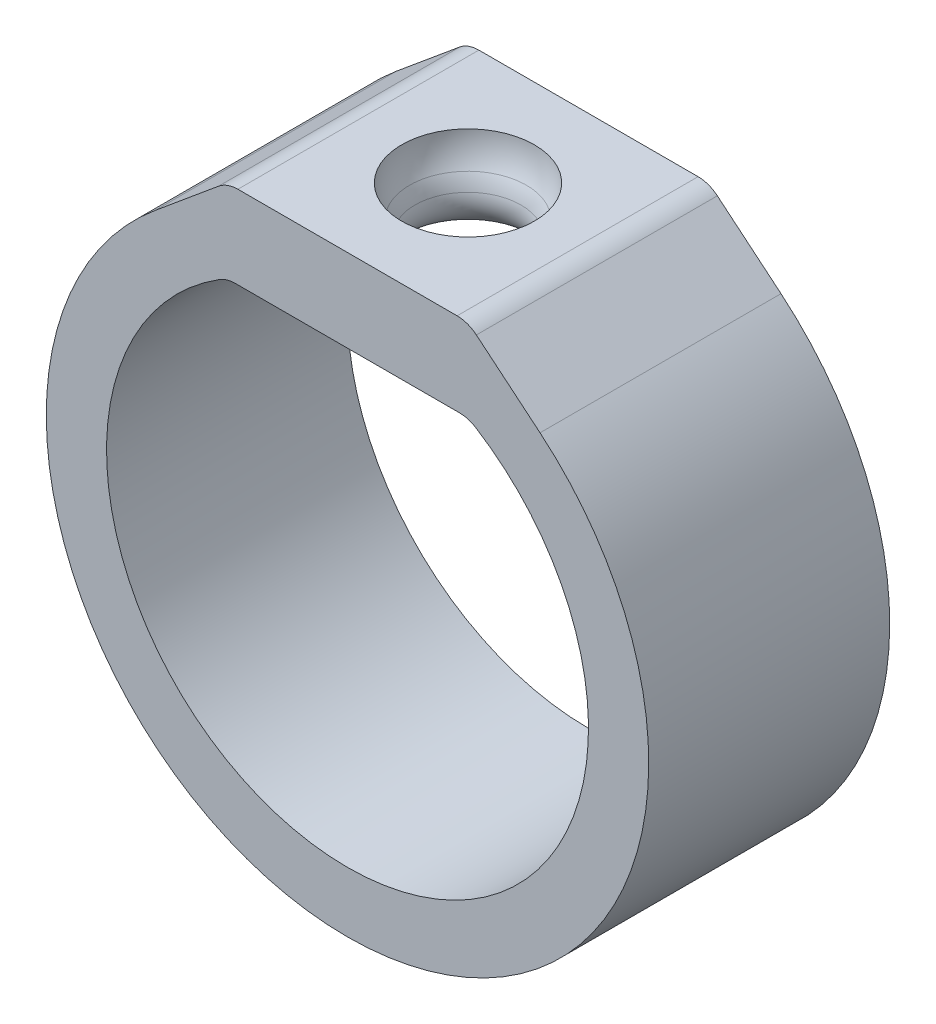
ISO-10303-21;
HEADER;
FILE_DESCRIPTION(('STEP AP214'),'2;1');
FILE_NAME('part.step','',(''),(''),'','','');
FILE_SCHEMA(('AUTOMOTIVE_DESIGN { 1 0 10303 214 1 1 1 1 }'));
ENDSEC;
DATA;
#1=APPLICATION_CONTEXT('core data for automotive mechanical design processes');
#2=APPLICATION_PROTOCOL_DEFINITION('international standard','automotive_design',2000,#1);
#3=PRODUCT_CONTEXT('',#1,'mechanical');
#4=PRODUCT('Part','Part','',(#3));
#5=PRODUCT_RELATED_PRODUCT_CATEGORY('part','',(#4));
#6=PRODUCT_DEFINITION_FORMATION('','',#4);
#7=PRODUCT_DEFINITION_CONTEXT('part definition',#1,'design');
#8=PRODUCT_DEFINITION('design','',#6,#7);
#9=PRODUCT_DEFINITION_SHAPE('','',#8);
#10=(LENGTH_UNIT() NAMED_UNIT(*) SI_UNIT(.MILLI.,.METRE.));
#11=(NAMED_UNIT(*) PLANE_ANGLE_UNIT() SI_UNIT($,.RADIAN.));
#12=(NAMED_UNIT(*) SI_UNIT($,.STERADIAN.) SOLID_ANGLE_UNIT());
#13=UNCERTAINTY_MEASURE_WITH_UNIT(LENGTH_MEASURE(1.E-05),#10,'distance_accuracy_value','');
#14=(GEOMETRIC_REPRESENTATION_CONTEXT(3) GLOBAL_UNCERTAINTY_ASSIGNED_CONTEXT((#13)) GLOBAL_UNIT_ASSIGNED_CONTEXT((#10,
#11,#12)) REPRESENTATION_CONTEXT('',''));
#15=CARTESIAN_POINT('',(0.,0.,0.));
#16=DIRECTION('',(0.,0.,1.));
#17=DIRECTION('',(1.,0.,0.));
#18=AXIS2_PLACEMENT_3D('',#15,#16,#17);
#19=CARTESIAN_POINT('',(0.,0.,4.));
#20=DIRECTION('',(0.,0.,-1.));
#21=DIRECTION('',(-1.,0.,0.));
#22=AXIS2_PLACEMENT_3D('',#19,#20,#21);
#23=PLANE('',#22);
#24=DIRECTION('',(-1.,0.,0.));
#25=VECTOR('',#24,1.);
#26=CARTESIAN_POINT('',(-4.,9.67820323027551,4.));
#27=LINE('',#26,#25);
#28=CARTESIAN_POINT('',(3.63872314880659,9.67820323027551,4.));
#29=VERTEX_POINT('',#28);
#30=CARTESIAN_POINT('',(-3.63872314880659,9.67820323027551,4.));
#31=VERTEX_POINT('',#30);
#32=EDGE_CURVE('E121',#29,#31,#27,.T.);
#33=ORIENTED_EDGE('',*,*,#32,.T.);
#34=CARTESIAN_POINT('',(-3.63872314880659,8.67820323027551,4.));
#35=DIRECTION('',(0.,0.,-1.));
#36=DIRECTION('',(-1.,0.,0.));
#37=AXIS2_PLACEMENT_3D('',#34,#35,#36);
#38=CIRCLE('',#37,1.);
#39=CARTESIAN_POINT('',(-4.27785654473791,9.44729912950089,4.));
#40=VERTEX_POINT('',#39);
#41=EDGE_CURVE('E166',#31,#40,#38,.F.);
#42=ORIENTED_EDGE('',*,*,#41,.T.);
#43=DIRECTION('',(-0.769095899225379,-0.639133395931324,0.));
#44=VECTOR('',#43,1.);
#45=CARTESIAN_POINT('',(-6.39133395931324,7.69095899225379,4.));
#46=LINE('',#45,#44);
#47=CARTESIAN_POINT('',(-6.39133395931324,7.69095899225379,4.));
#48=VERTEX_POINT('',#47);
#49=EDGE_CURVE('E127',#40,#48,#46,.T.);
#50=ORIENTED_EDGE('',*,*,#49,.T.);
#51=CARTESIAN_POINT('',(0.,0.,4.));
#52=DIRECTION('',(0.,0.,1.));
#53=DIRECTION('',(-1.,0.,0.));
#54=AXIS2_PLACEMENT_3D('',#51,#52,#53);
#55=CIRCLE('',#54,10.);
#56=CARTESIAN_POINT('',(6.39133395931324,7.69095899225379,4.));
#57=VERTEX_POINT('',#56);
#58=EDGE_CURVE('E122',#48,#57,#55,.T.);
#59=ORIENTED_EDGE('',*,*,#58,.T.);
#60=DIRECTION('',(-0.769095899225379,0.639133395931324,0.));
#61=VECTOR('',#60,1.);
#62=CARTESIAN_POINT('',(6.39133395931324,7.69095899225379,4.));
#63=LINE('',#62,#61);
#64=CARTESIAN_POINT('',(4.27785654473791,9.44729912950089,4.));
#65=VERTEX_POINT('',#64);
#66=EDGE_CURVE('E110',#57,#65,#63,.T.);
#67=ORIENTED_EDGE('',*,*,#66,.T.);
#68=CARTESIAN_POINT('',(3.63872314880659,8.67820323027551,4.));
#69=DIRECTION('',(0.,0.,-1.));
#70=DIRECTION('',(-1.,0.,0.));
#71=AXIS2_PLACEMENT_3D('',#68,#69,#70);
#72=CIRCLE('',#71,1.);
#73=EDGE_CURVE('E164',#65,#29,#72,.F.);
#74=ORIENTED_EDGE('',*,*,#73,.T.);
#75=EDGE_LOOP('',(#33,#42,#50,#59,#67,#74));
#76=FACE_BOUND('',#75,.T.);
#77=CARTESIAN_POINT('',(0.,0.,4.));
#78=DIRECTION('',(0.,0.,1.));
#79=DIRECTION('',(1.,0.,0.));
#80=AXIS2_PLACEMENT_3D('',#77,#78,#79);
#81=CIRCLE('',#80,8.);
#82=CARTESIAN_POINT('',(-4.2541936416096,6.77508940602915,4.));
#83=VERTEX_POINT('',#82);
#84=CARTESIAN_POINT('',(4.2541936416096,6.77508940602915,4.));
#85=VERTEX_POINT('',#84);
#86=EDGE_CURVE('E198',#83,#85,#81,.T.);
#87=ORIENTED_EDGE('',*,*,#86,.F.);
#88=CARTESIAN_POINT('',(-3.7224194364084,5.92820323027551,4.));
#89=DIRECTION('',(0.,0.,-1.));
#90=DIRECTION('',(-1.,0.,0.));
#91=AXIS2_PLACEMENT_3D('',#88,#89,#90);
#92=CIRCLE('',#91,1.);
#93=CARTESIAN_POINT('',(-3.7224194364084,6.92820323027551,4.));
#94=VERTEX_POINT('',#93);
#95=EDGE_CURVE('E11',#83,#94,#92,.T.);
#96=ORIENTED_EDGE('',*,*,#95,.T.);
#97=DIRECTION('',(-1.,0.,0.));
#98=VECTOR('',#97,1.);
#99=CARTESIAN_POINT('',(-4.,6.92820323027551,4.));
#100=LINE('',#99,#98);
#101=CARTESIAN_POINT('',(3.7224194364084,6.92820323027551,4.));
#102=VERTEX_POINT('',#101);
#103=EDGE_CURVE('E196',#102,#94,#100,.T.);
#104=ORIENTED_EDGE('',*,*,#103,.F.);
#105=CARTESIAN_POINT('',(3.7224194364084,5.92820323027551,4.));
#106=DIRECTION('',(0.,0.,-1.));
#107=DIRECTION('',(-1.,0.,0.));
#108=AXIS2_PLACEMENT_3D('',#105,#106,#107);
#109=CIRCLE('',#108,1.);
#110=EDGE_CURVE('E180',#102,#85,#109,.T.);
#111=ORIENTED_EDGE('',*,*,#110,.T.);
#112=EDGE_LOOP('',(#87,#96,#104,#111));
#113=FACE_BOUND('',#112,.T.);
#114=ADVANCED_FACE('F33',(#76,#113),#23,.F.);
#115=CARTESIAN_POINT('',(0.,0.,-4.));
#116=DIRECTION('',(0.,0.,-1.));
#117=DIRECTION('',(-1.,0.,0.));
#118=AXIS2_PLACEMENT_3D('',#115,#116,#117);
#119=PLANE('',#118);
#120=DIRECTION('',(-0.769095899225379,-0.639133395931324,0.));
#121=VECTOR('',#120,1.);
#122=CARTESIAN_POINT('',(-6.39133395931324,7.69095899225379,-4.));
#123=LINE('',#122,#121);
#124=CARTESIAN_POINT('',(-4.27785654473791,9.44729912950089,-4.));
#125=VERTEX_POINT('',#124);
#126=CARTESIAN_POINT('',(-6.39133395931324,7.69095899225379,-4.));
#127=VERTEX_POINT('',#126);
#128=EDGE_CURVE('E131',#125,#127,#123,.T.);
#129=ORIENTED_EDGE('',*,*,#128,.F.);
#130=CARTESIAN_POINT('',(-3.63872314880659,8.67820323027551,-4.));
#131=DIRECTION('',(0.,0.,-1.));
#132=DIRECTION('',(-1.,0.,0.));
#133=AXIS2_PLACEMENT_3D('',#130,#131,#132);
#134=CIRCLE('',#133,1.);
#135=CARTESIAN_POINT('',(-3.63872314880659,9.67820323027551,-4.));
#136=VERTEX_POINT('',#135);
#137=EDGE_CURVE('E157',#125,#136,#134,.T.);
#138=ORIENTED_EDGE('',*,*,#137,.T.);
#139=DIRECTION('',(-1.,0.,0.));
#140=VECTOR('',#139,1.);
#141=CARTESIAN_POINT('',(-4.,9.67820323027551,-4.));
#142=LINE('',#141,#140);
#143=CARTESIAN_POINT('',(3.63872314880659,9.67820323027551,-4.));
#144=VERTEX_POINT('',#143);
#145=EDGE_CURVE('E209',#144,#136,#142,.T.);
#146=ORIENTED_EDGE('',*,*,#145,.F.);
#147=CARTESIAN_POINT('',(3.63872314880659,8.67820323027551,-4.));
#148=DIRECTION('',(0.,0.,-1.));
#149=DIRECTION('',(-1.,0.,0.));
#150=AXIS2_PLACEMENT_3D('',#147,#148,#149);
#151=CIRCLE('',#150,1.);
#152=CARTESIAN_POINT('',(4.27785654473791,9.44729912950089,-4.));
#153=VERTEX_POINT('',#152);
#154=EDGE_CURVE('E155',#144,#153,#151,.T.);
#155=ORIENTED_EDGE('',*,*,#154,.T.);
#156=DIRECTION('',(-0.769095899225379,0.639133395931324,0.));
#157=VECTOR('',#156,1.);
#158=CARTESIAN_POINT('',(6.39133395931324,7.69095899225379,-4.));
#159=LINE('',#158,#157);
#160=CARTESIAN_POINT('',(6.39133395931324,7.69095899225379,-4.));
#161=VERTEX_POINT('',#160);
#162=EDGE_CURVE('E200',#161,#153,#159,.T.);
#163=ORIENTED_EDGE('',*,*,#162,.F.);
#164=CARTESIAN_POINT('',(0.,0.,-4.));
#165=DIRECTION('',(0.,0.,1.));
#166=DIRECTION('',(-1.,0.,0.));
#167=AXIS2_PLACEMENT_3D('',#164,#165,#166);
#168=CIRCLE('',#167,10.);
#169=EDGE_CURVE('E135',#127,#161,#168,.T.);
#170=ORIENTED_EDGE('',*,*,#169,.F.);
#171=EDGE_LOOP('',(#129,#138,#146,#155,#163,#170));
#172=FACE_BOUND('',#171,.T.);
#173=CARTESIAN_POINT('',(0.,0.,-4.));
#174=DIRECTION('',(0.,0.,1.));
#175=DIRECTION('',(1.,0.,0.));
#176=AXIS2_PLACEMENT_3D('',#173,#174,#175);
#177=CIRCLE('',#176,8.);
#178=CARTESIAN_POINT('',(-4.2541936416096,6.77508940602915,-4.));
#179=VERTEX_POINT('',#178);
#180=CARTESIAN_POINT('',(4.2541936416096,6.77508940602915,-4.));
#181=VERTEX_POINT('',#180);
#182=EDGE_CURVE('E147',#179,#181,#177,.T.);
#183=ORIENTED_EDGE('',*,*,#182,.T.);
#184=CARTESIAN_POINT('',(3.7224194364084,5.92820323027551,-4.));
#185=DIRECTION('',(0.,0.,-1.));
#186=DIRECTION('',(-1.,0.,0.));
#187=AXIS2_PLACEMENT_3D('',#184,#185,#186);
#188=CIRCLE('',#187,1.);
#189=CARTESIAN_POINT('',(3.7224194364084,6.92820323027551,-4.));
#190=VERTEX_POINT('',#189);
#191=EDGE_CURVE('E178',#181,#190,#188,.F.);
#192=ORIENTED_EDGE('',*,*,#191,.T.);
#193=DIRECTION('',(-1.,0.,0.));
#194=VECTOR('',#193,1.);
#195=CARTESIAN_POINT('',(-4.,6.92820323027551,-4.));
#196=LINE('',#195,#194);
#197=CARTESIAN_POINT('',(-3.7224194364084,6.92820323027551,-4.));
#198=VERTEX_POINT('',#197);
#199=EDGE_CURVE('E186',#190,#198,#196,.T.);
#200=ORIENTED_EDGE('',*,*,#199,.T.);
#201=CARTESIAN_POINT('',(-3.7224194364084,5.92820323027551,-4.));
#202=DIRECTION('',(0.,0.,-1.));
#203=DIRECTION('',(-1.,0.,0.));
#204=AXIS2_PLACEMENT_3D('',#201,#202,#203);
#205=CIRCLE('',#204,1.);
#206=EDGE_CURVE('E41',#198,#179,#205,.F.);
#207=ORIENTED_EDGE('',*,*,#206,.T.);
#208=EDGE_LOOP('',(#183,#192,#200,#207));
#209=FACE_BOUND('',#208,.T.);
#210=ADVANCED_FACE('F185',(#172,#209),#119,.T.);
#211=CARTESIAN_POINT('',(0.,0.,4.));
#212=DIRECTION('',(0.,0.,-1.));
#213=DIRECTION('',(-1.,0.,0.));
#214=AXIS2_PLACEMENT_3D('',#211,#212,#213);
#215=CYLINDRICAL_SURFACE('',#214,10.);
#216=ORIENTED_EDGE('',*,*,#169,.T.);
#217=DIRECTION('',(0.,0.,-1.));
#218=VECTOR('',#217,1.);
#219=CARTESIAN_POINT('',(6.39133395931324,7.69095899225379,4.));
#220=LINE('',#219,#218);
#221=EDGE_CURVE('E115',#57,#161,#220,.T.);
#222=ORIENTED_EDGE('',*,*,#221,.F.);
#223=ORIENTED_EDGE('',*,*,#58,.F.);
#224=DIRECTION('',(0.,0.,-1.));
#225=VECTOR('',#224,1.);
#226=CARTESIAN_POINT('',(-6.39133395931324,7.69095899225379,4.));
#227=LINE('',#226,#225);
#228=EDGE_CURVE('E137',#48,#127,#227,.T.);
#229=ORIENTED_EDGE('',*,*,#228,.T.);
#230=EDGE_LOOP('',(#216,#222,#223,#229));
#231=FACE_BOUND('',#230,.T.);
#232=ADVANCED_FACE('F133',(#231),#215,.T.);
#233=CARTESIAN_POINT('',(6.39133395931324,7.69095899225379,4.));
#234=DIRECTION('',(-0.639133395931324,-0.769095899225379,0.));
#235=DIRECTION('',(0.769095899225379,-0.639133395931324,0.));
#236=AXIS2_PLACEMENT_3D('',#233,#234,#235);
#237=PLANE('',#236);
#238=ORIENTED_EDGE('',*,*,#162,.T.);
#239=DIRECTION('',(0.,0.,-1.));
#240=VECTOR('',#239,1.);
#241=CARTESIAN_POINT('',(4.27785654473791,9.44729912950089,4.));
#242=LINE('',#241,#240);
#243=EDGE_CURVE('E118',#153,#65,#242,.F.);
#244=ORIENTED_EDGE('',*,*,#243,.T.);
#245=ORIENTED_EDGE('',*,*,#66,.F.);
#246=ORIENTED_EDGE('',*,*,#221,.T.);
#247=EDGE_LOOP('',(#238,#244,#245,#246));
#248=FACE_BOUND('',#247,.T.);
#249=ADVANCED_FACE('F113',(#248),#237,.F.);
#250=CARTESIAN_POINT('',(-4.,9.67820323027551,4.));
#251=DIRECTION('',(0.,-1.,0.));
#252=DIRECTION('',(0.,0.,-1.));
#253=AXIS2_PLACEMENT_3D('',#250,#251,#252);
#254=PLANE('',#253);
#255=CARTESIAN_POINT('',(0.,9.67820323027551,0.));
#256=DIRECTION('',(0.,-1.,0.));
#257=DIRECTION('',(0.,0.,-1.));
#258=AXIS2_PLACEMENT_3D('',#255,#256,#257);
#259=CIRCLE('',#258,2.20000000000001);
#260=CARTESIAN_POINT('',(0.,9.67820323027551,-2.20000000000001));
#261=VERTEX_POINT('',#260);
#262=EDGE_CURVE('E145',#261,#261,#259,.T.);
#263=ORIENTED_EDGE('',*,*,#262,.T.);
#264=EDGE_LOOP('',(#263));
#265=FACE_BOUND('',#264,.T.);
#266=ORIENTED_EDGE('',*,*,#145,.T.);
#267=DIRECTION('',(0.,0.,-1.));
#268=VECTOR('',#267,1.);
#269=CARTESIAN_POINT('',(-3.63872314880659,9.67820323027551,4.));
#270=LINE('',#269,#268);
#271=EDGE_CURVE('E162',#136,#31,#270,.F.);
#272=ORIENTED_EDGE('',*,*,#271,.T.);
#273=ORIENTED_EDGE('',*,*,#32,.F.);
#274=DIRECTION('',(0.,0.,-1.));
#275=VECTOR('',#274,1.);
#276=CARTESIAN_POINT('',(3.63872314880659,9.67820323027551,4.));
#277=LINE('',#276,#275);
#278=EDGE_CURVE('E159',#29,#144,#277,.T.);
#279=ORIENTED_EDGE('',*,*,#278,.T.);
#280=EDGE_LOOP('',(#266,#272,#273,#279));
#281=FACE_BOUND('',#280,.T.);
#282=ADVANCED_FACE('F223',(#265,#281),#254,.F.);
#283=CARTESIAN_POINT('',(-6.39133395931324,7.69095899225379,4.));
#284=DIRECTION('',(0.639133395931324,-0.769095899225379,0.));
#285=DIRECTION('',(0.769095899225379,0.639133395931324,0.));
#286=AXIS2_PLACEMENT_3D('',#283,#284,#285);
#287=PLANE('',#286);
#288=ORIENTED_EDGE('',*,*,#49,.F.);
#289=DIRECTION('',(0.,0.,-1.));
#290=VECTOR('',#289,1.);
#291=CARTESIAN_POINT('',(-4.27785654473791,9.44729912950089,4.));
#292=LINE('',#291,#290);
#293=EDGE_CURVE('E152',#40,#125,#292,.T.);
#294=ORIENTED_EDGE('',*,*,#293,.T.);
#295=ORIENTED_EDGE('',*,*,#128,.T.);
#296=ORIENTED_EDGE('',*,*,#228,.F.);
#297=EDGE_LOOP('',(#288,#294,#295,#296));
#298=FACE_BOUND('',#297,.T.);
#299=ADVANCED_FACE('F213',(#298),#287,.F.);
#300=CARTESIAN_POINT('',(0.,0.,4.));
#301=DIRECTION('',(0.,0.,-1.));
#302=DIRECTION('',(-1.,0.,0.));
#303=AXIS2_PLACEMENT_3D('',#300,#301,#302);
#304=CYLINDRICAL_SURFACE('',#303,8.);
#305=ORIENTED_EDGE('',*,*,#86,.T.);
#306=DIRECTION('',(0.,0.,-1.));
#307=VECTOR('',#306,1.);
#308=CARTESIAN_POINT('',(4.2541936416096,6.77508940602915,4.));
#309=LINE('',#308,#307);
#310=EDGE_CURVE('E171',#85,#181,#309,.T.);
#311=ORIENTED_EDGE('',*,*,#310,.T.);
#312=ORIENTED_EDGE('',*,*,#182,.F.);
#313=DIRECTION('',(0.,0.,-1.));
#314=VECTOR('',#313,1.);
#315=CARTESIAN_POINT('',(-4.2541936416096,6.77508940602915,4.));
#316=LINE('',#315,#314);
#317=EDGE_CURVE('E169',#179,#83,#316,.F.);
#318=ORIENTED_EDGE('',*,*,#317,.T.);
#319=EDGE_LOOP('',(#305,#311,#312,#318));
#320=FACE_BOUND('',#319,.T.);
#321=ADVANCED_FACE('F192',(#320),#304,.F.);
#322=CARTESIAN_POINT('',(-4.,6.92820323027551,4.));
#323=DIRECTION('',(0.,-1.,0.));
#324=DIRECTION('',(0.,0.,-1.));
#325=AXIS2_PLACEMENT_3D('',#322,#323,#324);
#326=PLANE('',#325);
#327=CARTESIAN_POINT('',(0.,6.92820323027551,0.));
#328=DIRECTION('',(0.,-1.,0.));
#329=DIRECTION('',(0.,0.,-1.));
#330=AXIS2_PLACEMENT_3D('',#327,#328,#329);
#331=CIRCLE('',#330,2.73019609728145);
#332=CARTESIAN_POINT('',(0.,6.92820323027551,-2.73019609728145));
#333=VERTEX_POINT('',#332);
#334=EDGE_CURVE('E140',#333,#333,#331,.F.);
#335=ORIENTED_EDGE('',*,*,#334,.T.);
#336=EDGE_LOOP('',(#335));
#337=FACE_BOUND('',#336,.T.);
#338=ORIENTED_EDGE('',*,*,#199,.F.);
#339=DIRECTION('',(0.,0.,1.));
#340=VECTOR('',#339,1.);
#341=CARTESIAN_POINT('',(3.7224194364084,6.92820323027551,4.));
#342=LINE('',#341,#340);
#343=EDGE_CURVE('E53',#190,#102,#342,.T.);
#344=ORIENTED_EDGE('',*,*,#343,.T.);
#345=ORIENTED_EDGE('',*,*,#103,.T.);
#346=DIRECTION('',(0.,0.,1.));
#347=VECTOR('',#346,1.);
#348=CARTESIAN_POINT('',(-3.7224194364084,6.92820323027551,-4.));
#349=LINE('',#348,#347);
#350=EDGE_CURVE('E174',#94,#198,#349,.F.);
#351=ORIENTED_EDGE('',*,*,#350,.T.);
#352=EDGE_LOOP('',(#338,#344,#345,#351));
#353=FACE_BOUND('',#352,.T.);
#354=ADVANCED_FACE('F195',(#337,#353),#326,.T.);
#355=CARTESIAN_POINT('',(0.,9.67820323027551,0.));
#356=DIRECTION('',(0.,-1.,0.));
#357=DIRECTION('',(1.,0.,0.));
#358=AXIS2_PLACEMENT_3D('',#355,#356,#357);
#359=SPHERICAL_SURFACE('',#358,2.20000000000001);
#360=CARTESIAN_POINT('',(0.,8.64290911262844,0.));
#361=DIRECTION('',(0.,-1.,0.));
#362=DIRECTION('',(1.,0.,0.));
#363=AXIS2_PLACEMENT_3D('',#360,#361,#362);
#364=CIRCLE('',#363,1.94117647058824);
#365=CARTESIAN_POINT('',(1.94117647058824,8.64290911262844,0.));
#366=VERTEX_POINT('',#365);
#367=EDGE_CURVE('E148',#366,#366,#364,.T.);
#368=ORIENTED_EDGE('',*,*,#367,.T.);
#369=EDGE_LOOP('',(#368));
#370=FACE_BOUND('',#369,.T.);
#371=ORIENTED_EDGE('',*,*,#262,.F.);
#372=EDGE_LOOP('',(#371));
#373=FACE_BOUND('',#372,.T.);
#374=ADVANCED_FACE('F284',(#370,#373),#359,.F.);
#375=CARTESIAN_POINT('',(0.,7.6782032302755,0.));
#376=DIRECTION('',(0.,-1.,0.));
#377=DIRECTION('',(1.,0.,0.));
#378=AXIS2_PLACEMENT_3D('',#375,#376,#377);
#379=TOROIDAL_SURFACE('',#378,3.74999999999998,2.04999999999998);
#380=CARTESIAN_POINT('',(0.,8.16629846837076,0.));
#381=DIRECTION('',(0.,-1.,0.));
#382=DIRECTION('',(0.,0.,-1.));
#383=AXIS2_PLACEMENT_3D('',#380,#381,#382);
#384=CIRCLE('',#383,1.75895428516854);
#385=CARTESIAN_POINT('',(0.,8.16629846837076,-1.75895428516854));
#386=VERTEX_POINT('',#385);
#387=EDGE_CURVE('E136',#386,#386,#384,.T.);
#388=ORIENTED_EDGE('',*,*,#387,.T.);
#389=EDGE_LOOP('',(#388));
#390=FACE_BOUND('',#389,.T.);
#391=ORIENTED_EDGE('',*,*,#367,.F.);
#392=EDGE_LOOP('',(#391));
#393=FACE_BOUND('',#392,.T.);
#394=ADVANCED_FACE('F236',(#390,#393),#379,.T.);
#395=CARTESIAN_POINT('',(0.,7.92820323027551,0.));
#396=DIRECTION('',(0.,1.,0.));
#397=DIRECTION('',(0.,0.,1.));
#398=AXIS2_PLACEMENT_3D('',#395,#396,#397);
#399=TOROIDAL_SURFACE('',#398,2.73019609728145,1.);
#400=ORIENTED_EDGE('',*,*,#334,.F.);
#401=EDGE_LOOP('',(#400));
#402=FACE_BOUND('',#401,.T.);
#403=ORIENTED_EDGE('',*,*,#387,.F.);
#404=EDGE_LOOP('',(#403));
#405=FACE_BOUND('',#404,.T.);
#406=ADVANCED_FACE('F228',(#402,#405),#399,.T.);
#407=CARTESIAN_POINT('',(-3.63872314880659,8.67820323027551,4.));
#408=DIRECTION('',(0.,0.,-1.));
#409=DIRECTION('',(-1.,0.,0.));
#410=AXIS2_PLACEMENT_3D('',#407,#408,#409);
#411=CYLINDRICAL_SURFACE('',#410,1.);
#412=ORIENTED_EDGE('',*,*,#41,.F.);
#413=ORIENTED_EDGE('',*,*,#271,.F.);
#414=ORIENTED_EDGE('',*,*,#137,.F.);
#415=ORIENTED_EDGE('',*,*,#293,.F.);
#416=EDGE_LOOP('',(#412,#413,#414,#415));
#417=FACE_BOUND('',#416,.T.);
#418=ADVANCED_FACE('F226',(#417),#411,.T.);
#419=CARTESIAN_POINT('',(3.63872314880659,8.67820323027551,4.));
#420=DIRECTION('',(0.,0.,-1.));
#421=DIRECTION('',(-1.,0.,0.));
#422=AXIS2_PLACEMENT_3D('',#419,#420,#421);
#423=CYLINDRICAL_SURFACE('',#422,1.);
#424=ORIENTED_EDGE('',*,*,#73,.F.);
#425=ORIENTED_EDGE('',*,*,#243,.F.);
#426=ORIENTED_EDGE('',*,*,#154,.F.);
#427=ORIENTED_EDGE('',*,*,#278,.F.);
#428=EDGE_LOOP('',(#424,#425,#426,#427));
#429=FACE_BOUND('',#428,.T.);
#430=ADVANCED_FACE('F218',(#429),#423,.T.);
#431=CARTESIAN_POINT('',(3.7224194364084,5.92820323027551,4.));
#432=DIRECTION('',(0.,0.,-1.));
#433=DIRECTION('',(-1.,0.,0.));
#434=AXIS2_PLACEMENT_3D('',#431,#432,#433);
#435=CYLINDRICAL_SURFACE('',#434,1.);
#436=ORIENTED_EDGE('',*,*,#110,.F.);
#437=ORIENTED_EDGE('',*,*,#343,.F.);
#438=ORIENTED_EDGE('',*,*,#191,.F.);
#439=ORIENTED_EDGE('',*,*,#310,.F.);
#440=EDGE_LOOP('',(#436,#437,#438,#439));
#441=FACE_BOUND('',#440,.T.);
#442=ADVANCED_FACE('F234',(#441),#435,.F.);
#443=CARTESIAN_POINT('',(-3.7224194364084,5.92820323027551,4.));
#444=DIRECTION('',(0.,0.,-1.));
#445=DIRECTION('',(-1.,0.,0.));
#446=AXIS2_PLACEMENT_3D('',#443,#444,#445);
#447=CYLINDRICAL_SURFACE('',#446,1.);
#448=ORIENTED_EDGE('',*,*,#95,.F.);
#449=ORIENTED_EDGE('',*,*,#317,.F.);
#450=ORIENTED_EDGE('',*,*,#206,.F.);
#451=ORIENTED_EDGE('',*,*,#350,.F.);
#452=EDGE_LOOP('',(#448,#449,#450,#451));
#453=FACE_BOUND('',#452,.T.);
#454=ADVANCED_FACE('F35',(#453),#447,.F.);
#455=CLOSED_SHELL('',(#114,#210,#232,#249,#282,#299,#321,#354,#374,#394,#406,#418,#430,#442,#454));
#456=MANIFOLD_SOLID_BREP('B2',#455);
#457=ADVANCED_BREP_SHAPE_REPRESENTATION('',(#18,#456),#14);
#458=SHAPE_DEFINITION_REPRESENTATION(#9,#457);
ENDSEC;
END-ISO-10303-21;
